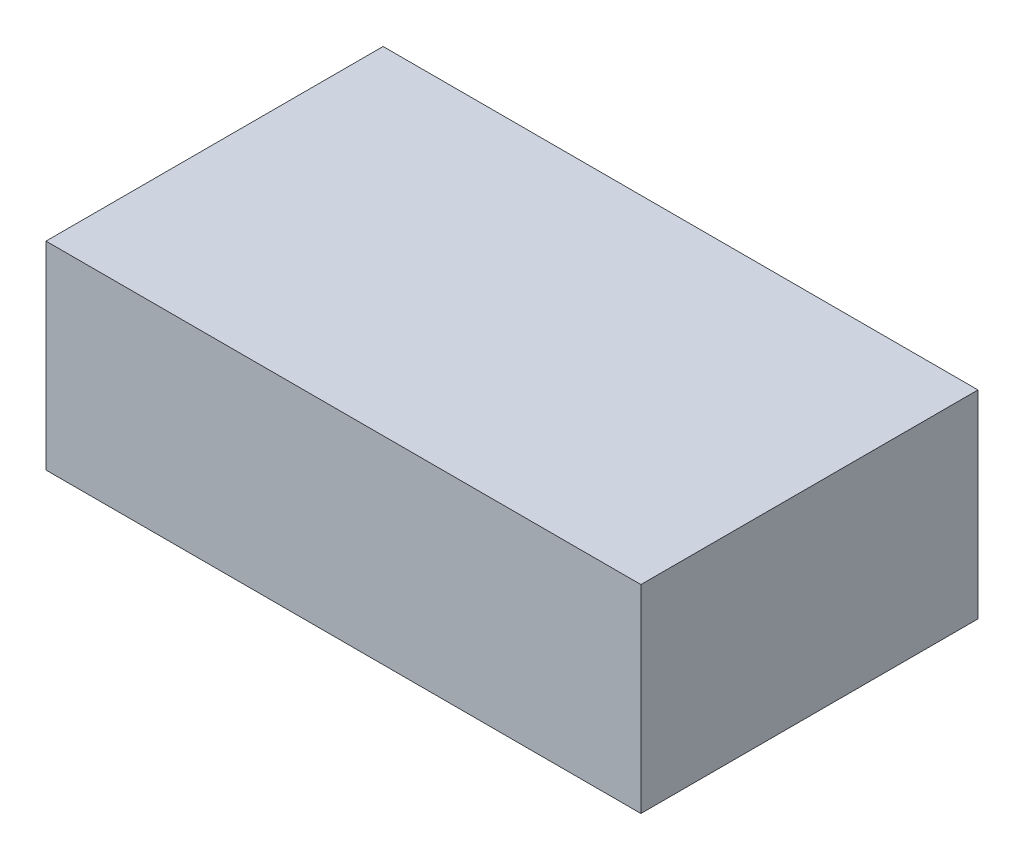
ISO-10303-21;
HEADER;
FILE_DESCRIPTION(('STEP AP214'),'2;1');
FILE_NAME('part.step','',(''),(''),'','','');
FILE_SCHEMA(('AUTOMOTIVE_DESIGN { 1 0 10303 214 1 1 1 1 }'));
ENDSEC;
DATA;
#1=APPLICATION_CONTEXT('core data for automotive mechanical design processes');
#2=APPLICATION_PROTOCOL_DEFINITION('international standard','automotive_design',2000,#1);
#3=PRODUCT_CONTEXT('',#1,'mechanical');
#4=PRODUCT('Part','Part','',(#3));
#5=PRODUCT_RELATED_PRODUCT_CATEGORY('part','',(#4));
#6=PRODUCT_DEFINITION_FORMATION('','',#4);
#7=PRODUCT_DEFINITION_CONTEXT('part definition',#1,'design');
#8=PRODUCT_DEFINITION('design','',#6,#7);
#9=PRODUCT_DEFINITION_SHAPE('','',#8);
#10=(LENGTH_UNIT() NAMED_UNIT(*) SI_UNIT(.MILLI.,.METRE.));
#11=(NAMED_UNIT(*) PLANE_ANGLE_UNIT() SI_UNIT($,.RADIAN.));
#12=(NAMED_UNIT(*) SI_UNIT($,.STERADIAN.) SOLID_ANGLE_UNIT());
#13=UNCERTAINTY_MEASURE_WITH_UNIT(LENGTH_MEASURE(1.E-05),#10,'distance_accuracy_value','');
#14=(GEOMETRIC_REPRESENTATION_CONTEXT(3) GLOBAL_UNCERTAINTY_ASSIGNED_CONTEXT((#13)) GLOBAL_UNIT_ASSIGNED_CONTEXT((#10,
#11,#12)) REPRESENTATION_CONTEXT('',''));
#15=CARTESIAN_POINT('',(0.,0.,0.));
#16=DIRECTION('',(0.,0.,1.));
#17=DIRECTION('',(1.,0.,0.));
#18=AXIS2_PLACEMENT_3D('',#15,#16,#17);
#19=CARTESIAN_POINT('',(0.,127.,0.));
#20=DIRECTION('',(1.,0.,0.));
#21=DIRECTION('',(0.,0.,-1.));
#22=AXIS2_PLACEMENT_3D('',#19,#20,#21);
#23=PLANE('',#22);
#24=DIRECTION('',(0.,0.,1.));
#25=VECTOR('',#24,1.);
#26=CARTESIAN_POINT('',(0.,0.,0.));
#27=LINE('',#26,#25);
#28=CARTESIAN_POINT('',(0.,0.,-215.9));
#29=VERTEX_POINT('',#28);
#30=CARTESIAN_POINT('',(0.,0.,0.));
#31=VERTEX_POINT('',#30);
#32=EDGE_CURVE('E107',#29,#31,#27,.T.);
#33=ORIENTED_EDGE('',*,*,#32,.T.);
#34=DIRECTION('',(0.,-1.,0.));
#35=VECTOR('',#34,1.);
#36=CARTESIAN_POINT('',(0.,127.,0.));
#37=LINE('',#36,#35);
#38=CARTESIAN_POINT('',(0.,127.,0.));
#39=VERTEX_POINT('',#38);
#40=EDGE_CURVE('E11',#39,#31,#37,.T.);
#41=ORIENTED_EDGE('',*,*,#40,.F.);
#42=DIRECTION('',(0.,0.,1.));
#43=VECTOR('',#42,1.);
#44=CARTESIAN_POINT('',(0.,127.,0.));
#45=LINE('',#44,#43);
#46=CARTESIAN_POINT('',(0.,127.,-215.9));
#47=VERTEX_POINT('',#46);
#48=EDGE_CURVE('E91',#47,#39,#45,.T.);
#49=ORIENTED_EDGE('',*,*,#48,.F.);
#50=DIRECTION('',(0.,-1.,0.));
#51=VECTOR('',#50,1.);
#52=CARTESIAN_POINT('',(0.,127.,-215.9));
#53=LINE('',#52,#51);
#54=EDGE_CURVE('E103',#47,#29,#53,.T.);
#55=ORIENTED_EDGE('',*,*,#54,.T.);
#56=EDGE_LOOP('',(#33,#41,#49,#55));
#57=FACE_BOUND('',#56,.T.);
#58=ADVANCED_FACE('F39',(#57),#23,.F.);
#59=CARTESIAN_POINT('',(0.,127.,0.));
#60=DIRECTION('',(0.,0.,-1.));
#61=DIRECTION('',(-1.,0.,0.));
#62=AXIS2_PLACEMENT_3D('',#59,#60,#61);
#63=PLANE('',#62);
#64=DIRECTION('',(1.,0.,0.));
#65=VECTOR('',#64,1.);
#66=CARTESIAN_POINT('',(0.,0.,0.));
#67=LINE('',#66,#65);
#68=CARTESIAN_POINT('',(381.,0.,0.));
#69=VERTEX_POINT('',#68);
#70=EDGE_CURVE('E96',#31,#69,#67,.T.);
#71=ORIENTED_EDGE('',*,*,#70,.T.);
#72=DIRECTION('',(0.,-1.,0.));
#73=VECTOR('',#72,1.);
#74=CARTESIAN_POINT('',(381.,127.,0.));
#75=LINE('',#74,#73);
#76=CARTESIAN_POINT('',(381.,127.,0.));
#77=VERTEX_POINT('',#76);
#78=EDGE_CURVE('E48',#77,#69,#75,.T.);
#79=ORIENTED_EDGE('',*,*,#78,.F.);
#80=DIRECTION('',(1.,0.,0.));
#81=VECTOR('',#80,1.);
#82=CARTESIAN_POINT('',(0.,127.,0.));
#83=LINE('',#82,#81);
#84=EDGE_CURVE('E86',#39,#77,#83,.T.);
#85=ORIENTED_EDGE('',*,*,#84,.F.);
#86=ORIENTED_EDGE('',*,*,#40,.T.);
#87=EDGE_LOOP('',(#71,#79,#85,#86));
#88=FACE_BOUND('',#87,.T.);
#89=ADVANCED_FACE('F95',(#88),#63,.F.);
#90=CARTESIAN_POINT('',(381.,127.,0.));
#91=DIRECTION('',(-1.,0.,0.));
#92=DIRECTION('',(0.,0.,1.));
#93=AXIS2_PLACEMENT_3D('',#90,#91,#92);
#94=PLANE('',#93);
#95=DIRECTION('',(0.,0.,-1.));
#96=VECTOR('',#95,1.);
#97=CARTESIAN_POINT('',(381.,0.,0.));
#98=LINE('',#97,#96);
#99=CARTESIAN_POINT('',(381.,0.,-215.9));
#100=VERTEX_POINT('',#99);
#101=EDGE_CURVE('E73',#69,#100,#98,.T.);
#102=ORIENTED_EDGE('',*,*,#101,.T.);
#103=DIRECTION('',(0.,-1.,0.));
#104=VECTOR('',#103,1.);
#105=CARTESIAN_POINT('',(381.,127.,-215.9));
#106=LINE('',#105,#104);
#107=CARTESIAN_POINT('',(381.,127.,-215.9));
#108=VERTEX_POINT('',#107);
#109=EDGE_CURVE('E98',#108,#100,#106,.T.);
#110=ORIENTED_EDGE('',*,*,#109,.F.);
#111=DIRECTION('',(0.,0.,-1.));
#112=VECTOR('',#111,1.);
#113=CARTESIAN_POINT('',(381.,127.,0.));
#114=LINE('',#113,#112);
#115=EDGE_CURVE('E89',#77,#108,#114,.T.);
#116=ORIENTED_EDGE('',*,*,#115,.F.);
#117=ORIENTED_EDGE('',*,*,#78,.T.);
#118=EDGE_LOOP('',(#102,#110,#116,#117));
#119=FACE_BOUND('',#118,.T.);
#120=ADVANCED_FACE('F99',(#119),#94,.F.);
#121=CARTESIAN_POINT('',(0.,127.,-215.9));
#122=DIRECTION('',(0.,0.,1.));
#123=DIRECTION('',(1.,0.,0.));
#124=AXIS2_PLACEMENT_3D('',#121,#122,#123);
#125=PLANE('',#124);
#126=DIRECTION('',(-1.,0.,0.));
#127=VECTOR('',#126,1.);
#128=CARTESIAN_POINT('',(0.,0.,-215.9));
#129=LINE('',#128,#127);
#130=EDGE_CURVE('E79',#100,#29,#129,.T.);
#131=ORIENTED_EDGE('',*,*,#130,.T.);
#132=ORIENTED_EDGE('',*,*,#54,.F.);
#133=DIRECTION('',(-1.,0.,0.));
#134=VECTOR('',#133,1.);
#135=CARTESIAN_POINT('',(0.,127.,-215.9));
#136=LINE('',#135,#134);
#137=EDGE_CURVE('E56',#108,#47,#136,.T.);
#138=ORIENTED_EDGE('',*,*,#137,.F.);
#139=ORIENTED_EDGE('',*,*,#109,.T.);
#140=EDGE_LOOP('',(#131,#132,#138,#139));
#141=FACE_BOUND('',#140,.T.);
#142=ADVANCED_FACE('F120',(#141),#125,.F.);
#143=CARTESIAN_POINT('',(0.,127.,0.));
#144=DIRECTION('',(0.,-1.,0.));
#145=DIRECTION('',(0.,0.,-1.));
#146=AXIS2_PLACEMENT_3D('',#143,#144,#145);
#147=PLANE('',#146);
#148=ORIENTED_EDGE('',*,*,#48,.T.);
#149=ORIENTED_EDGE('',*,*,#84,.T.);
#150=ORIENTED_EDGE('',*,*,#115,.T.);
#151=ORIENTED_EDGE('',*,*,#137,.T.);
#152=EDGE_LOOP('',(#148,#149,#150,#151));
#153=FACE_BOUND('',#152,.T.);
#154=ADVANCED_FACE('F87',(#153),#147,.F.);
#155=CARTESIAN_POINT('',(0.,0.,0.));
#156=DIRECTION('',(0.,-1.,0.));
#157=DIRECTION('',(0.,0.,-1.));
#158=AXIS2_PLACEMENT_3D('',#155,#156,#157);
#159=PLANE('',#158);
#160=ORIENTED_EDGE('',*,*,#32,.F.);
#161=ORIENTED_EDGE('',*,*,#130,.F.);
#162=ORIENTED_EDGE('',*,*,#101,.F.);
#163=ORIENTED_EDGE('',*,*,#70,.F.);
#164=EDGE_LOOP('',(#160,#161,#162,#163));
#165=FACE_BOUND('',#164,.T.);
#166=ADVANCED_FACE('F123',(#165),#159,.T.);
#167=CLOSED_SHELL('',(#58,#89,#120,#142,#154,#166));
#168=MANIFOLD_SOLID_BREP('B2',#167);
#169=ADVANCED_BREP_SHAPE_REPRESENTATION('',(#18,#168),#14);
#170=SHAPE_DEFINITION_REPRESENTATION(#9,#169);
ENDSEC;
END-ISO-10303-21;
